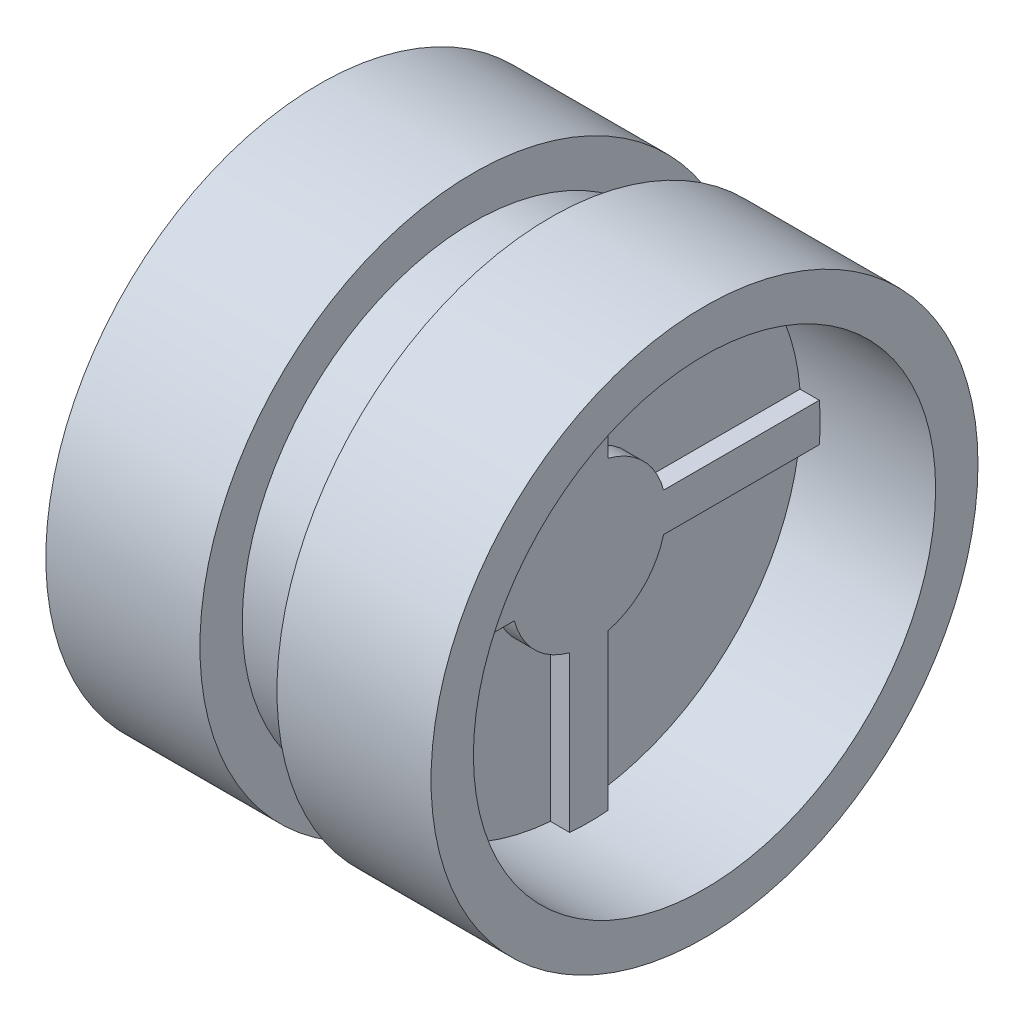
ISO-10303-21;
HEADER;
FILE_DESCRIPTION(('STEP AP214'),'2;1');
FILE_NAME('part.step','',(''),(''),'','','');
FILE_SCHEMA(('AUTOMOTIVE_DESIGN { 1 0 10303 214 1 1 1 1 }'));
ENDSEC;
DATA;
#1=APPLICATION_CONTEXT('core data for automotive mechanical design processes');
#2=APPLICATION_PROTOCOL_DEFINITION('international standard','automotive_design',2000,#1);
#3=PRODUCT_CONTEXT('',#1,'mechanical');
#4=PRODUCT('Part','Part','',(#3));
#5=PRODUCT_RELATED_PRODUCT_CATEGORY('part','',(#4));
#6=PRODUCT_DEFINITION_FORMATION('','',#4);
#7=PRODUCT_DEFINITION_CONTEXT('part definition',#1,'design');
#8=PRODUCT_DEFINITION('design','',#6,#7);
#9=PRODUCT_DEFINITION_SHAPE('','',#8);
#10=(LENGTH_UNIT() NAMED_UNIT(*) SI_UNIT(.MILLI.,.METRE.));
#11=(NAMED_UNIT(*) PLANE_ANGLE_UNIT() SI_UNIT($,.RADIAN.));
#12=(NAMED_UNIT(*) SI_UNIT($,.STERADIAN.) SOLID_ANGLE_UNIT());
#13=UNCERTAINTY_MEASURE_WITH_UNIT(LENGTH_MEASURE(1.E-05),#10,'distance_accuracy_value','');
#14=(GEOMETRIC_REPRESENTATION_CONTEXT(3) GLOBAL_UNCERTAINTY_ASSIGNED_CONTEXT((#13)) GLOBAL_UNIT_ASSIGNED_CONTEXT((#10,
#11,#12)) REPRESENTATION_CONTEXT('',''));
#15=CARTESIAN_POINT('',(0.,0.,0.));
#16=DIRECTION('',(0.,0.,1.));
#17=DIRECTION('',(1.,0.,0.));
#18=AXIS2_PLACEMENT_3D('',#15,#16,#17);
#19=CARTESIAN_POINT('',(1.5,6.,0.));
#20=DIRECTION('',(1.,0.,0.));
#21=DIRECTION('',(0.,0.,-1.));
#22=AXIS2_PLACEMENT_3D('',#19,#20,#21);
#23=PLANE('',#22);
#24=DIRECTION('',(0.,1.,0.));
#25=VECTOR('',#24,1.);
#26=CARTESIAN_POINT('',(1.5,6.,-0.500000000000192));
#27=LINE('',#26,#25);
#28=CARTESIAN_POINT('',(1.5,-5.97913037155068,-0.500000000000192));
#29=VERTEX_POINT('',#28);
#30=CARTESIAN_POINT('',(1.5,-1.93649167310366,-0.500000000000192));
#31=VERTEX_POINT('',#30);
#32=EDGE_CURVE('E151',#29,#31,#27,.T.);
#33=ORIENTED_EDGE('',*,*,#32,.F.);
#34=CARTESIAN_POINT('',(1.5,0.,0.));
#35=DIRECTION('',(1.,0.,0.));
#36=DIRECTION('',(0.,0.,-1.));
#37=AXIS2_PLACEMENT_3D('',#34,#35,#36);
#38=CIRCLE('',#37,6.);
#39=CARTESIAN_POINT('',(1.5,-0.499999999999919,-5.97913037155071));
#40=VERTEX_POINT('',#39);
#41=EDGE_CURVE('E259',#29,#40,#38,.T.);
#42=ORIENTED_EDGE('',*,*,#41,.T.);
#43=DIRECTION('',(0.,0.,1.));
#44=VECTOR('',#43,1.);
#45=CARTESIAN_POINT('',(1.5,-0.500000000000039,-1.30743457061774E-13));
#46=LINE('',#45,#44);
#47=CARTESIAN_POINT('',(1.5,-0.5,-1.93649167310371));
#48=VERTEX_POINT('',#47);
#49=EDGE_CURVE('E53',#40,#48,#46,.T.);
#50=ORIENTED_EDGE('',*,*,#49,.T.);
#51=CARTESIAN_POINT('',(1.5,0.,0.));
#52=DIRECTION('',(1.,0.,0.));
#53=DIRECTION('',(0.,0.,-1.));
#54=AXIS2_PLACEMENT_3D('',#51,#52,#53);
#55=CIRCLE('',#54,2.);
#56=EDGE_CURVE('E11',#48,#31,#55,.F.);
#57=ORIENTED_EDGE('',*,*,#56,.T.);
#58=EDGE_LOOP('',(#33,#42,#50,#57));
#59=FACE_BOUND('',#58,.T.);
#60=ADVANCED_FACE('F35',(#59),#23,.T.);
#61=DIRECTION('',(0.,0.,1.));
#62=VECTOR('',#61,1.);
#63=CARTESIAN_POINT('',(1.5,0.500000000000192,0.));
#64=LINE('',#63,#62);
#65=CARTESIAN_POINT('',(1.5,0.500000000000191,-5.97913037155068));
#66=VERTEX_POINT('',#65);
#67=CARTESIAN_POINT('',(1.5,0.500000000000192,-1.93649167310366));
#68=VERTEX_POINT('',#67);
#69=EDGE_CURVE('E252',#66,#68,#64,.T.);
#70=ORIENTED_EDGE('',*,*,#69,.F.);
#71=CARTESIAN_POINT('',(1.5,5.9791303715507,-0.5));
#72=VERTEX_POINT('',#71);
#73=EDGE_CURVE('E260',#66,#72,#38,.T.);
#74=ORIENTED_EDGE('',*,*,#73,.T.);
#75=DIRECTION('',(0.,-1.,0.));
#76=VECTOR('',#75,1.);
#77=CARTESIAN_POINT('',(1.5,6.,-0.5));
#78=LINE('',#77,#76);
#79=CARTESIAN_POINT('',(1.5,1.93649167310371,-0.5));
#80=VERTEX_POINT('',#79);
#81=EDGE_CURVE('E250',#72,#80,#78,.T.);
#82=ORIENTED_EDGE('',*,*,#81,.T.);
#83=CARTESIAN_POINT('',(1.5,0.,0.));
#84=DIRECTION('',(1.,0.,0.));
#85=DIRECTION('',(0.,0.,-1.));
#86=AXIS2_PLACEMENT_3D('',#83,#84,#85);
#87=CIRCLE('',#86,2.);
#88=EDGE_CURVE('E43',#80,#68,#87,.F.);
#89=ORIENTED_EDGE('',*,*,#88,.T.);
#90=EDGE_LOOP('',(#70,#74,#82,#89));
#91=FACE_BOUND('',#90,.T.);
#92=ADVANCED_FACE('F302',(#91),#23,.T.);
#93=DIRECTION('',(0.,-1.,0.));
#94=VECTOR('',#93,1.);
#95=CARTESIAN_POINT('',(1.5,6.00000000000001,0.500000000000105));
#96=LINE('',#95,#94);
#97=CARTESIAN_POINT('',(1.5,5.97913037155069,0.500000000000105));
#98=VERTEX_POINT('',#97);
#99=CARTESIAN_POINT('',(1.5,1.93649167310366,0.500000000000192));
#100=VERTEX_POINT('',#99);
#101=EDGE_CURVE('E247',#98,#100,#96,.T.);
#102=ORIENTED_EDGE('',*,*,#101,.F.);
#103=CARTESIAN_POINT('',(1.5,0.500000000000003,5.9791303715507));
#104=VERTEX_POINT('',#103);
#105=EDGE_CURVE('E264',#98,#104,#38,.T.);
#106=ORIENTED_EDGE('',*,*,#105,.T.);
#107=DIRECTION('',(0.,0.,-1.));
#108=VECTOR('',#107,1.);
#109=CARTESIAN_POINT('',(1.5,0.499999999999998,0.));
#110=LINE('',#109,#108);
#111=CARTESIAN_POINT('',(1.5,0.499999999999999,1.93649167310371));
#112=VERTEX_POINT('',#111);
#113=EDGE_CURVE('E245',#104,#112,#110,.T.);
#114=ORIENTED_EDGE('',*,*,#113,.T.);
#115=CARTESIAN_POINT('',(1.5,0.,0.));
#116=DIRECTION('',(1.,0.,0.));
#117=DIRECTION('',(0.,0.,-1.));
#118=AXIS2_PLACEMENT_3D('',#115,#116,#117);
#119=CIRCLE('',#118,2.);
#120=EDGE_CURVE('E299',#112,#100,#119,.F.);
#121=ORIENTED_EDGE('',*,*,#120,.T.);
#122=EDGE_LOOP('',(#102,#106,#114,#121));
#123=FACE_BOUND('',#122,.T.);
#124=ADVANCED_FACE('F337',(#123),#23,.T.);
#125=CARTESIAN_POINT('',(1.5,0.,0.));
#126=DIRECTION('',(1.,0.,0.));
#127=DIRECTION('',(0.,0.,-1.));
#128=AXIS2_PLACEMENT_3D('',#125,#126,#127);
#129=CYLINDRICAL_SURFACE('',#128,6.);
#130=CARTESIAN_POINT('',(5.,0.,0.));
#131=DIRECTION('',(1.,0.,0.));
#132=DIRECTION('',(0.,0.,-1.));
#133=AXIS2_PLACEMENT_3D('',#130,#131,#132);
#134=CIRCLE('',#133,6.);
#135=CARTESIAN_POINT('',(5.,0.,-6.));
#136=VERTEX_POINT('',#135);
#137=EDGE_CURVE('E263',#136,#136,#134,.T.);
#138=ORIENTED_EDGE('',*,*,#137,.T.);
#139=EDGE_LOOP('',(#138));
#140=FACE_BOUND('',#139,.T.);
#141=CARTESIAN_POINT('',(2.,0.,0.));
#142=DIRECTION('',(1.,0.,0.));
#143=DIRECTION('',(0.,0.,-1.));
#144=AXIS2_PLACEMENT_3D('',#141,#142,#143);
#145=CIRCLE('',#144,6.00000000000005);
#146=CARTESIAN_POINT('',(2.,5.9791303715507,-0.5));
#147=VERTEX_POINT('',#146);
#148=CARTESIAN_POINT('',(2.,5.97913037155069,0.500000000000096));
#149=VERTEX_POINT('',#148);
#150=EDGE_CURVE('E186',#147,#149,#145,.T.);
#151=ORIENTED_EDGE('',*,*,#150,.F.);
#152=DIRECTION('',(-1.,0.,0.));
#153=VECTOR('',#152,1.);
#154=CARTESIAN_POINT('',(2.,5.9791303715507,-0.5));
#155=LINE('',#154,#153);
#156=EDGE_CURVE('E225',#147,#72,#155,.T.);
#157=ORIENTED_EDGE('',*,*,#156,.T.);
#158=ORIENTED_EDGE('',*,*,#73,.F.);
#159=DIRECTION('',(-1.,0.,0.));
#160=VECTOR('',#159,1.);
#161=CARTESIAN_POINT('',(2.,0.500000000000191,-5.97913037155074));
#162=LINE('',#161,#160);
#163=CARTESIAN_POINT('',(2.,0.500000000000191,-5.97913037155074));
#164=VERTEX_POINT('',#163);
#165=EDGE_CURVE('E233',#164,#66,#162,.T.);
#166=ORIENTED_EDGE('',*,*,#165,.F.);
#167=CARTESIAN_POINT('',(2.,0.,0.));
#168=DIRECTION('',(1.,0.,0.));
#169=DIRECTION('',(0.,0.,-1.));
#170=AXIS2_PLACEMENT_3D('',#167,#168,#169);
#171=CIRCLE('',#170,6.0000000000001);
#172=CARTESIAN_POINT('',(2.,-0.499999999999919,-5.9791303715507));
#173=VERTEX_POINT('',#172);
#174=EDGE_CURVE('E175',#173,#164,#171,.T.);
#175=ORIENTED_EDGE('',*,*,#174,.F.);
#176=DIRECTION('',(-1.,0.,0.));
#177=VECTOR('',#176,1.);
#178=CARTESIAN_POINT('',(2.,-0.499999999999919,-5.97913037155084));
#179=LINE('',#178,#177);
#180=EDGE_CURVE('E236',#173,#40,#179,.T.);
#181=ORIENTED_EDGE('',*,*,#180,.T.);
#182=ORIENTED_EDGE('',*,*,#41,.F.);
#183=DIRECTION('',(-1.,0.,0.));
#184=VECTOR('',#183,1.);
#185=CARTESIAN_POINT('',(2.,-5.97913037155078,-0.500000000000192));
#186=LINE('',#185,#184);
#187=CARTESIAN_POINT('',(2.,-5.97913037155068,-0.500000000000184));
#188=VERTEX_POINT('',#187);
#189=EDGE_CURVE('E153',#188,#29,#186,.T.);
#190=ORIENTED_EDGE('',*,*,#189,.F.);
#191=CARTESIAN_POINT('',(2.,0.,0.));
#192=DIRECTION('',(1.,0.,0.));
#193=DIRECTION('',(0.,0.,-1.));
#194=AXIS2_PLACEMENT_3D('',#191,#192,#193);
#195=CIRCLE('',#194,6.00000000000007);
#196=CARTESIAN_POINT('',(2.,-5.9791303715507,0.500000000000003));
#197=VERTEX_POINT('',#196);
#198=EDGE_CURVE('E168',#197,#188,#195,.T.);
#199=ORIENTED_EDGE('',*,*,#198,.F.);
#200=DIRECTION('',(-1.,0.,0.));
#201=VECTOR('',#200,1.);
#202=CARTESIAN_POINT('',(2.,-5.97913037155075,0.500000000000003));
#203=LINE('',#202,#201);
#204=CARTESIAN_POINT('',(1.5,-5.9791303715507,0.500000000000003));
#205=VERTEX_POINT('',#204);
#206=EDGE_CURVE('E240',#197,#205,#203,.T.);
#207=ORIENTED_EDGE('',*,*,#206,.T.);
#208=CARTESIAN_POINT('',(1.5,-0.500000000000192,5.97913037155068));
#209=VERTEX_POINT('',#208);
#210=EDGE_CURVE('E338',#209,#205,#38,.T.);
#211=ORIENTED_EDGE('',*,*,#210,.F.);
#212=DIRECTION('',(-1.,0.,0.));
#213=VECTOR('',#212,1.);
#214=CARTESIAN_POINT('',(2.,-0.500000000000192,5.97913037155074));
#215=LINE('',#214,#213);
#216=CARTESIAN_POINT('',(2.,-0.500000000000187,5.97913037155068));
#217=VERTEX_POINT('',#216);
#218=EDGE_CURVE('E211',#217,#209,#215,.T.);
#219=ORIENTED_EDGE('',*,*,#218,.F.);
#220=CARTESIAN_POINT('',(2.,0.,0.));
#221=DIRECTION('',(1.,0.,0.));
#222=DIRECTION('',(0.,0.,-1.));
#223=AXIS2_PLACEMENT_3D('',#220,#221,#222);
#224=CIRCLE('',#223,6.00000000000005);
#225=CARTESIAN_POINT('',(2.,0.500000000000003,5.9791303715507));
#226=VERTEX_POINT('',#225);
#227=EDGE_CURVE('E197',#226,#217,#224,.T.);
#228=ORIENTED_EDGE('',*,*,#227,.F.);
#229=DIRECTION('',(-1.,0.,0.));
#230=VECTOR('',#229,1.);
#231=CARTESIAN_POINT('',(2.,0.500000000000003,5.97913037155075));
#232=LINE('',#231,#230);
#233=EDGE_CURVE('E214',#226,#104,#232,.T.);
#234=ORIENTED_EDGE('',*,*,#233,.T.);
#235=ORIENTED_EDGE('',*,*,#105,.F.);
#236=DIRECTION('',(-1.,0.,0.));
#237=VECTOR('',#236,1.);
#238=CARTESIAN_POINT('',(2.,5.9791303715508,0.500000000000105));
#239=LINE('',#238,#237);
#240=EDGE_CURVE('E222',#149,#98,#239,.T.);
#241=ORIENTED_EDGE('',*,*,#240,.F.);
#242=EDGE_LOOP('',(#151,#157,#158,#166,#175,#181,#182,#190,#199,#207,#211,#219,#228,#234,#235,#241));
#243=FACE_BOUND('',#242,.T.);
#244=ADVANCED_FACE('F315',(#140,#243),#129,.F.);
#245=ORIENTED_EDGE('',*,*,#210,.T.);
#246=DIRECTION('',(0.,1.,0.));
#247=VECTOR('',#246,1.);
#248=CARTESIAN_POINT('',(1.5,6.,0.499999999999993));
#249=LINE('',#248,#247);
#250=CARTESIAN_POINT('',(1.5,-1.93649167310369,0.499999999999994));
#251=VERTEX_POINT('',#250);
#252=EDGE_CURVE('E257',#205,#251,#249,.T.);
#253=ORIENTED_EDGE('',*,*,#252,.T.);
#254=CARTESIAN_POINT('',(1.5,0.,0.));
#255=DIRECTION('',(1.,0.,0.));
#256=DIRECTION('',(0.,0.,-1.));
#257=AXIS2_PLACEMENT_3D('',#254,#255,#256);
#258=CIRCLE('',#257,1.99999999999998);
#259=CARTESIAN_POINT('',(1.5,-0.500000000000144,1.93649167310365));
#260=VERTEX_POINT('',#259);
#261=EDGE_CURVE('E297',#251,#260,#258,.F.);
#262=ORIENTED_EDGE('',*,*,#261,.T.);
#263=DIRECTION('',(0.,0.,-1.));
#264=VECTOR('',#263,1.);
#265=CARTESIAN_POINT('',(1.5,-0.500000000000112,0.));
#266=LINE('',#265,#264);
#267=EDGE_CURVE('E242',#209,#260,#266,.T.);
#268=ORIENTED_EDGE('',*,*,#267,.F.);
#269=EDGE_LOOP('',(#245,#253,#262,#268));
#270=FACE_BOUND('',#269,.T.);
#271=ADVANCED_FACE('F37',(#270),#23,.T.);
#272=CARTESIAN_POINT('',(-5.,0.,0.));
#273=DIRECTION('',(-1.,0.,0.));
#274=DIRECTION('',(0.,0.,1.));
#275=AXIS2_PLACEMENT_3D('',#272,#273,#274);
#276=PLANE('',#275);
#277=CARTESIAN_POINT('',(-5.,0.,0.));
#278=DIRECTION('',(-1.,0.,0.));
#279=DIRECTION('',(0.,0.,1.));
#280=AXIS2_PLACEMENT_3D('',#277,#278,#279);
#281=CIRCLE('',#280,1.5);
#282=CARTESIAN_POINT('',(-5.,0.,1.5));
#283=VERTEX_POINT('',#282);
#284=EDGE_CURVE('E549',#283,#283,#281,.T.);
#285=ORIENTED_EDGE('',*,*,#284,.F.);
#286=EDGE_LOOP('',(#285));
#287=FACE_BOUND('',#286,.T.);
#288=CARTESIAN_POINT('',(-5.,0.,0.));
#289=DIRECTION('',(1.,0.,0.));
#290=DIRECTION('',(0.,0.,-1.));
#291=AXIS2_PLACEMENT_3D('',#288,#289,#290);
#292=CIRCLE('',#291,3.);
#293=CARTESIAN_POINT('',(-5.,0.,-3.));
#294=VERTEX_POINT('',#293);
#295=EDGE_CURVE('E294',#294,#294,#292,.T.);
#296=ORIENTED_EDGE('',*,*,#295,.F.);
#297=EDGE_LOOP('',(#296));
#298=FACE_BOUND('',#297,.T.);
#299=ADVANCED_FACE('F358',(#287,#298),#276,.T.);
#300=CARTESIAN_POINT('',(1.5,0.,0.));
#301=DIRECTION('',(1.,0.,0.));
#302=DIRECTION('',(0.,0.,-1.));
#303=AXIS2_PLACEMENT_3D('',#300,#301,#302);
#304=CYLINDRICAL_SURFACE('',#303,3.);
#305=ORIENTED_EDGE('',*,*,#295,.T.);
#306=EDGE_LOOP('',(#305));
#307=FACE_BOUND('',#306,.T.);
#308=CARTESIAN_POINT('',(-1.5,0.,0.));
#309=DIRECTION('',(1.,0.,0.));
#310=DIRECTION('',(0.,0.,-1.));
#311=AXIS2_PLACEMENT_3D('',#308,#309,#310);
#312=CIRCLE('',#311,3.);
#313=CARTESIAN_POINT('',(-1.5,0.,-3.));
#314=VERTEX_POINT('',#313);
#315=EDGE_CURVE('E291',#314,#314,#312,.T.);
#316=ORIENTED_EDGE('',*,*,#315,.F.);
#317=EDGE_LOOP('',(#316));
#318=FACE_BOUND('',#317,.T.);
#319=ADVANCED_FACE('F363',(#307,#318),#304,.T.);
#320=CARTESIAN_POINT('',(-1.5,3.,0.));
#321=DIRECTION('',(-1.,0.,0.));
#322=DIRECTION('',(0.,0.,1.));
#323=AXIS2_PLACEMENT_3D('',#320,#321,#322);
#324=PLANE('',#323);
#325=ORIENTED_EDGE('',*,*,#315,.T.);
#326=EDGE_LOOP('',(#325));
#327=FACE_BOUND('',#326,.T.);
#328=CARTESIAN_POINT('',(-1.5,0.,0.));
#329=DIRECTION('',(1.,0.,0.));
#330=DIRECTION('',(0.,0.,-1.));
#331=AXIS2_PLACEMENT_3D('',#328,#329,#330);
#332=CIRCLE('',#331,6.);
#333=CARTESIAN_POINT('',(-1.5,0.,-6.));
#334=VERTEX_POINT('',#333);
#335=EDGE_CURVE('E288',#334,#334,#332,.T.);
#336=ORIENTED_EDGE('',*,*,#335,.F.);
#337=EDGE_LOOP('',(#336));
#338=FACE_BOUND('',#337,.T.);
#339=ADVANCED_FACE('F559',(#327,#338),#324,.T.);
#340=CARTESIAN_POINT('',(1.5,0.,0.));
#341=DIRECTION('',(1.,0.,0.));
#342=DIRECTION('',(0.,0.,-1.));
#343=AXIS2_PLACEMENT_3D('',#340,#341,#342);
#344=CYLINDRICAL_SURFACE('',#343,6.);
#345=ORIENTED_EDGE('',*,*,#335,.T.);
#346=EDGE_LOOP('',(#345));
#347=FACE_BOUND('',#346,.T.);
#348=CARTESIAN_POINT('',(-5.,0.,0.));
#349=DIRECTION('',(1.,0.,0.));
#350=DIRECTION('',(0.,0.,-1.));
#351=AXIS2_PLACEMENT_3D('',#348,#349,#350);
#352=CIRCLE('',#351,6.);
#353=CARTESIAN_POINT('',(-5.,0.,-6.));
#354=VERTEX_POINT('',#353);
#355=EDGE_CURVE('E285',#354,#354,#352,.T.);
#356=ORIENTED_EDGE('',*,*,#355,.F.);
#357=EDGE_LOOP('',(#356));
#358=FACE_BOUND('',#357,.T.);
#359=ADVANCED_FACE('F565',(#347,#358),#344,.F.);
#360=CARTESIAN_POINT('',(-5.,6.,0.));
#361=DIRECTION('',(-1.,0.,0.));
#362=DIRECTION('',(0.,0.,1.));
#363=AXIS2_PLACEMENT_3D('',#360,#361,#362);
#364=PLANE('',#363);
#365=ORIENTED_EDGE('',*,*,#355,.T.);
#366=EDGE_LOOP('',(#365));
#367=FACE_BOUND('',#366,.T.);
#368=CARTESIAN_POINT('',(-5.,0.,0.));
#369=DIRECTION('',(1.,0.,0.));
#370=DIRECTION('',(0.,0.,-1.));
#371=AXIS2_PLACEMENT_3D('',#368,#369,#370);
#372=CIRCLE('',#371,7.1);
#373=CARTESIAN_POINT('',(-5.,0.,-7.1));
#374=VERTEX_POINT('',#373);
#375=EDGE_CURVE('E282',#374,#374,#372,.T.);
#376=ORIENTED_EDGE('',*,*,#375,.F.);
#377=EDGE_LOOP('',(#376));
#378=FACE_BOUND('',#377,.T.);
#379=ADVANCED_FACE('F571',(#367,#378),#364,.T.);
#380=CARTESIAN_POINT('',(1.5,0.,0.));
#381=DIRECTION('',(1.,0.,0.));
#382=DIRECTION('',(0.,0.,-1.));
#383=AXIS2_PLACEMENT_3D('',#380,#381,#382);
#384=CYLINDRICAL_SURFACE('',#383,7.1);
#385=ORIENTED_EDGE('',*,*,#375,.T.);
#386=EDGE_LOOP('',(#385));
#387=FACE_BOUND('',#386,.T.);
#388=CARTESIAN_POINT('',(-1.,0.,0.));
#389=DIRECTION('',(1.,0.,0.));
#390=DIRECTION('',(0.,0.,-1.));
#391=AXIS2_PLACEMENT_3D('',#388,#389,#390);
#392=CIRCLE('',#391,7.1);
#393=CARTESIAN_POINT('',(-1.,0.,-7.1));
#394=VERTEX_POINT('',#393);
#395=EDGE_CURVE('E279',#394,#394,#392,.T.);
#396=ORIENTED_EDGE('',*,*,#395,.F.);
#397=EDGE_LOOP('',(#396));
#398=FACE_BOUND('',#397,.T.);
#399=ADVANCED_FACE('F577',(#387,#398),#384,.T.);
#400=CARTESIAN_POINT('',(-1.,7.1,0.));
#401=DIRECTION('',(1.,0.,0.));
#402=DIRECTION('',(0.,0.,-1.));
#403=AXIS2_PLACEMENT_3D('',#400,#401,#402);
#404=PLANE('',#403);
#405=ORIENTED_EDGE('',*,*,#395,.T.);
#406=EDGE_LOOP('',(#405));
#407=FACE_BOUND('',#406,.T.);
#408=CARTESIAN_POINT('',(-1.,0.,0.));
#409=DIRECTION('',(1.,0.,0.));
#410=DIRECTION('',(0.,0.,-1.));
#411=AXIS2_PLACEMENT_3D('',#408,#409,#410);
#412=CIRCLE('',#411,6.);
#413=CARTESIAN_POINT('',(-1.,0.,-6.));
#414=VERTEX_POINT('',#413);
#415=EDGE_CURVE('E276',#414,#414,#412,.T.);
#416=ORIENTED_EDGE('',*,*,#415,.F.);
#417=EDGE_LOOP('',(#416));
#418=FACE_BOUND('',#417,.T.);
#419=ADVANCED_FACE('F393',(#407,#418),#404,.T.);
#420=CARTESIAN_POINT('',(1.5,0.,0.));
#421=DIRECTION('',(1.,0.,0.));
#422=DIRECTION('',(0.,0.,-1.));
#423=AXIS2_PLACEMENT_3D('',#420,#421,#422);
#424=CYLINDRICAL_SURFACE('',#423,6.);
#425=CARTESIAN_POINT('',(1.,0.,0.));
#426=DIRECTION('',(1.,0.,0.));
#427=DIRECTION('',(0.,0.,-1.));
#428=AXIS2_PLACEMENT_3D('',#425,#426,#427);
#429=CIRCLE('',#428,6.);
#430=CARTESIAN_POINT('',(1.,0.,-6.));
#431=VERTEX_POINT('',#430);
#432=EDGE_CURVE('E273',#431,#431,#429,.T.);
#433=ORIENTED_EDGE('',*,*,#432,.F.);
#434=EDGE_LOOP('',(#433));
#435=FACE_BOUND('',#434,.T.);
#436=ORIENTED_EDGE('',*,*,#415,.T.);
#437=EDGE_LOOP('',(#436));
#438=FACE_BOUND('',#437,.T.);
#439=ADVANCED_FACE('F387',(#435,#438),#424,.T.);
#440=CARTESIAN_POINT('',(1.,7.1,0.));
#441=DIRECTION('',(-1.,0.,0.));
#442=DIRECTION('',(0.,0.,1.));
#443=AXIS2_PLACEMENT_3D('',#440,#441,#442);
#444=PLANE('',#443);
#445=ORIENTED_EDGE('',*,*,#432,.T.);
#446=EDGE_LOOP('',(#445));
#447=FACE_BOUND('',#446,.T.);
#448=CARTESIAN_POINT('',(1.,0.,0.));
#449=DIRECTION('',(1.,0.,0.));
#450=DIRECTION('',(0.,0.,-1.));
#451=AXIS2_PLACEMENT_3D('',#448,#449,#450);
#452=CIRCLE('',#451,7.1);
#453=CARTESIAN_POINT('',(1.,0.,-7.1));
#454=VERTEX_POINT('',#453);
#455=EDGE_CURVE('E270',#454,#454,#452,.T.);
#456=ORIENTED_EDGE('',*,*,#455,.F.);
#457=EDGE_LOOP('',(#456));
#458=FACE_BOUND('',#457,.T.);
#459=ADVANCED_FACE('F392',(#447,#458),#444,.T.);
#460=CARTESIAN_POINT('',(1.5,0.,0.));
#461=DIRECTION('',(1.,0.,0.));
#462=DIRECTION('',(0.,0.,-1.));
#463=AXIS2_PLACEMENT_3D('',#460,#461,#462);
#464=CYLINDRICAL_SURFACE('',#463,7.1);
#465=ORIENTED_EDGE('',*,*,#455,.T.);
#466=EDGE_LOOP('',(#465));
#467=FACE_BOUND('',#466,.T.);
#468=CARTESIAN_POINT('',(5.,0.,0.));
#469=DIRECTION('',(1.,0.,0.));
#470=DIRECTION('',(0.,0.,-1.));
#471=AXIS2_PLACEMENT_3D('',#468,#469,#470);
#472=CIRCLE('',#471,7.1);
#473=CARTESIAN_POINT('',(5.,0.,-7.1));
#474=VERTEX_POINT('',#473);
#475=EDGE_CURVE('E267',#474,#474,#472,.T.);
#476=ORIENTED_EDGE('',*,*,#475,.F.);
#477=EDGE_LOOP('',(#476));
#478=FACE_BOUND('',#477,.T.);
#479=ADVANCED_FACE('F405',(#467,#478),#464,.T.);
#480=CARTESIAN_POINT('',(5.,6.,0.));
#481=DIRECTION('',(1.,0.,0.));
#482=DIRECTION('',(0.,0.,-1.));
#483=AXIS2_PLACEMENT_3D('',#480,#481,#482);
#484=PLANE('',#483);
#485=ORIENTED_EDGE('',*,*,#475,.T.);
#486=EDGE_LOOP('',(#485));
#487=FACE_BOUND('',#486,.T.);
#488=ORIENTED_EDGE('',*,*,#137,.F.);
#489=EDGE_LOOP('',(#488));
#490=FACE_BOUND('',#489,.T.);
#491=ADVANCED_FACE('F418',(#487,#490),#484,.T.);
#492=CARTESIAN_POINT('',(2.,0.,0.499999999999998));
#493=DIRECTION('',(0.,0.,-1.));
#494=DIRECTION('',(0.,1.,0.));
#495=AXIS2_PLACEMENT_3D('',#492,#493,#494);
#496=PLANE('',#495);
#497=ORIENTED_EDGE('',*,*,#252,.F.);
#498=ORIENTED_EDGE('',*,*,#206,.F.);
#499=DIRECTION('',(0.,-1.,0.));
#500=VECTOR('',#499,1.);
#501=CARTESIAN_POINT('',(2.,0.,0.499999999999998));
#502=LINE('',#501,#500);
#503=CARTESIAN_POINT('',(2.,-1.93649167310371,0.5));
#504=VERTEX_POINT('',#503);
#505=EDGE_CURVE('E170',#504,#197,#502,.T.);
#506=ORIENTED_EDGE('',*,*,#505,.F.);
#507=DIRECTION('',(-1.,0.,0.));
#508=VECTOR('',#507,1.);
#509=CARTESIAN_POINT('',(2.,-1.93649167310371,0.5));
#510=LINE('',#509,#508);
#511=EDGE_CURVE('E205',#504,#251,#510,.T.);
#512=ORIENTED_EDGE('',*,*,#511,.T.);
#513=EDGE_LOOP('',(#497,#498,#506,#512));
#514=FACE_BOUND('',#513,.T.);
#515=ADVANCED_FACE('F413',(#514),#496,.F.);
#516=CARTESIAN_POINT('',(2.,0.,-0.500000000000192));
#517=DIRECTION('',(0.,0.,-1.));
#518=DIRECTION('',(0.,1.,0.));
#519=AXIS2_PLACEMENT_3D('',#516,#517,#518);
#520=PLANE('',#519);
#521=ORIENTED_EDGE('',*,*,#189,.T.);
#522=ORIENTED_EDGE('',*,*,#32,.T.);
#523=DIRECTION('',(-1.,0.,0.));
#524=VECTOR('',#523,1.);
#525=CARTESIAN_POINT('',(2.,-1.93649167310366,-0.500000000000192));
#526=LINE('',#525,#524);
#527=CARTESIAN_POINT('',(2.,-1.93649167310366,-0.500000000000192));
#528=VERTEX_POINT('',#527);
#529=EDGE_CURVE('E145',#528,#31,#526,.T.);
#530=ORIENTED_EDGE('',*,*,#529,.F.);
#531=DIRECTION('',(0.,-1.,0.));
#532=VECTOR('',#531,1.);
#533=CARTESIAN_POINT('',(2.,0.,-0.500000000000192));
#534=LINE('',#533,#532);
#535=EDGE_CURVE('E150',#528,#188,#534,.T.);
#536=ORIENTED_EDGE('',*,*,#535,.T.);
#537=EDGE_LOOP('',(#521,#522,#530,#536));
#538=FACE_BOUND('',#537,.T.);
#539=ADVANCED_FACE('F148',(#538),#520,.T.);
#540=CARTESIAN_POINT('',(2.,0.,0.));
#541=DIRECTION('',(-1.,0.,0.));
#542=DIRECTION('',(0.,0.,1.));
#543=AXIS2_PLACEMENT_3D('',#540,#541,#542);
#544=CYLINDRICAL_SURFACE('',#543,2.);
#545=ORIENTED_EDGE('',*,*,#56,.F.);
#546=DIRECTION('',(-1.,0.,0.));
#547=VECTOR('',#546,1.);
#548=CARTESIAN_POINT('',(2.,-0.5,-1.93649167310371));
#549=LINE('',#548,#547);
#550=CARTESIAN_POINT('',(2.,-0.5,-1.93649167310371));
#551=VERTEX_POINT('',#550);
#552=EDGE_CURVE('E154',#551,#48,#549,.T.);
#553=ORIENTED_EDGE('',*,*,#552,.F.);
#554=CARTESIAN_POINT('',(2.,0.,0.));
#555=DIRECTION('',(1.,0.,0.));
#556=DIRECTION('',(0.,0.,-1.));
#557=AXIS2_PLACEMENT_3D('',#554,#555,#556);
#558=CIRCLE('',#557,2.);
#559=EDGE_CURVE('E157',#528,#551,#558,.T.);
#560=ORIENTED_EDGE('',*,*,#559,.F.);
#561=ORIENTED_EDGE('',*,*,#529,.T.);
#562=EDGE_LOOP('',(#545,#553,#560,#561));
#563=FACE_BOUND('',#562,.T.);
#564=ADVANCED_FACE('F158',(#563),#544,.T.);
#565=CARTESIAN_POINT('',(2.,-0.500000000000039,0.));
#566=DIRECTION('',(0.,1.,0.));
#567=DIRECTION('',(0.,0.,1.));
#568=AXIS2_PLACEMENT_3D('',#565,#566,#567);
#569=PLANE('',#568);
#570=ORIENTED_EDGE('',*,*,#49,.F.);
#571=ORIENTED_EDGE('',*,*,#180,.F.);
#572=DIRECTION('',(0.,0.,-1.));
#573=VECTOR('',#572,1.);
#574=CARTESIAN_POINT('',(2.,-0.500000000000039,0.));
#575=LINE('',#574,#573);
#576=EDGE_CURVE('E163',#551,#173,#575,.T.);
#577=ORIENTED_EDGE('',*,*,#576,.F.);
#578=ORIENTED_EDGE('',*,*,#552,.T.);
#579=EDGE_LOOP('',(#570,#571,#577,#578));
#580=FACE_BOUND('',#579,.T.);
#581=ADVANCED_FACE('F344',(#580),#569,.F.);
#582=CARTESIAN_POINT('',(2.,0.500000000000192,0.));
#583=DIRECTION('',(0.,1.,0.));
#584=DIRECTION('',(0.,0.,1.));
#585=AXIS2_PLACEMENT_3D('',#582,#583,#584);
#586=PLANE('',#585);
#587=ORIENTED_EDGE('',*,*,#165,.T.);
#588=ORIENTED_EDGE('',*,*,#69,.T.);
#589=DIRECTION('',(-1.,0.,0.));
#590=VECTOR('',#589,1.);
#591=CARTESIAN_POINT('',(2.,0.500000000000192,-1.93649167310366));
#592=LINE('',#591,#590);
#593=CARTESIAN_POINT('',(2.,0.500000000000192,-1.93649167310366));
#594=VERTEX_POINT('',#593);
#595=EDGE_CURVE('E230',#594,#68,#592,.T.);
#596=ORIENTED_EDGE('',*,*,#595,.F.);
#597=DIRECTION('',(0.,0.,-1.));
#598=VECTOR('',#597,1.);
#599=CARTESIAN_POINT('',(2.,0.500000000000192,0.));
#600=LINE('',#599,#598);
#601=EDGE_CURVE('E178',#594,#164,#600,.T.);
#602=ORIENTED_EDGE('',*,*,#601,.T.);
#603=EDGE_LOOP('',(#587,#588,#596,#602));
#604=FACE_BOUND('',#603,.T.);
#605=ADVANCED_FACE('F308',(#604),#586,.T.);
#606=CARTESIAN_POINT('',(2.,0.,0.));
#607=DIRECTION('',(-1.,0.,0.));
#608=DIRECTION('',(0.,0.,1.));
#609=AXIS2_PLACEMENT_3D('',#606,#607,#608);
#610=CYLINDRICAL_SURFACE('',#609,2.);
#611=ORIENTED_EDGE('',*,*,#88,.F.);
#612=DIRECTION('',(-1.,0.,0.));
#613=VECTOR('',#612,1.);
#614=CARTESIAN_POINT('',(2.,1.93649167310371,-0.5));
#615=LINE('',#614,#613);
#616=CARTESIAN_POINT('',(2.,1.93649167310371,-0.5));
#617=VERTEX_POINT('',#616);
#618=EDGE_CURVE('E227',#617,#80,#615,.T.);
#619=ORIENTED_EDGE('',*,*,#618,.F.);
#620=CARTESIAN_POINT('',(2.,0.,0.));
#621=DIRECTION('',(1.,0.,0.));
#622=DIRECTION('',(0.,0.,-1.));
#623=AXIS2_PLACEMENT_3D('',#620,#621,#622);
#624=CIRCLE('',#623,2.);
#625=EDGE_CURVE('E181',#594,#617,#624,.T.);
#626=ORIENTED_EDGE('',*,*,#625,.F.);
#627=ORIENTED_EDGE('',*,*,#595,.T.);
#628=EDGE_LOOP('',(#611,#619,#626,#627));
#629=FACE_BOUND('',#628,.T.);
#630=ADVANCED_FACE('F310',(#629),#610,.T.);
#631=CARTESIAN_POINT('',(2.,0.,-0.5));
#632=DIRECTION('',(0.,0.,1.));
#633=DIRECTION('',(1.,0.,0.));
#634=AXIS2_PLACEMENT_3D('',#631,#632,#633);
#635=PLANE('',#634);
#636=ORIENTED_EDGE('',*,*,#81,.F.);
#637=ORIENTED_EDGE('',*,*,#156,.F.);
#638=DIRECTION('',(0.,1.,0.));
#639=VECTOR('',#638,1.);
#640=CARTESIAN_POINT('',(2.,0.,-0.5));
#641=LINE('',#640,#639);
#642=EDGE_CURVE('E183',#617,#147,#641,.T.);
#643=ORIENTED_EDGE('',*,*,#642,.F.);
#644=ORIENTED_EDGE('',*,*,#618,.T.);
#645=EDGE_LOOP('',(#636,#637,#643,#644));
#646=FACE_BOUND('',#645,.T.);
#647=ADVANCED_FACE('F319',(#646),#635,.F.);
#648=CARTESIAN_POINT('',(2.,0.,0.500000000000233));
#649=DIRECTION('',(0.,0.,1.));
#650=DIRECTION('',(0.,-1.,0.));
#651=AXIS2_PLACEMENT_3D('',#648,#649,#650);
#652=PLANE('',#651);
#653=ORIENTED_EDGE('',*,*,#240,.T.);
#654=ORIENTED_EDGE('',*,*,#101,.T.);
#655=DIRECTION('',(-1.,0.,0.));
#656=VECTOR('',#655,1.);
#657=CARTESIAN_POINT('',(2.,1.93649167310366,0.500000000000192));
#658=LINE('',#657,#656);
#659=CARTESIAN_POINT('',(2.,1.93649167310366,0.500000000000192));
#660=VERTEX_POINT('',#659);
#661=EDGE_CURVE('E219',#660,#100,#658,.T.);
#662=ORIENTED_EDGE('',*,*,#661,.F.);
#663=DIRECTION('',(0.,1.,0.));
#664=VECTOR('',#663,1.);
#665=CARTESIAN_POINT('',(2.,0.,0.500000000000233));
#666=LINE('',#665,#664);
#667=EDGE_CURVE('E189',#660,#149,#666,.T.);
#668=ORIENTED_EDGE('',*,*,#667,.T.);
#669=EDGE_LOOP('',(#653,#654,#662,#668));
#670=FACE_BOUND('',#669,.T.);
#671=ADVANCED_FACE('F322',(#670),#652,.T.);
#672=CARTESIAN_POINT('',(2.,0.,0.));
#673=DIRECTION('',(-1.,0.,0.));
#674=DIRECTION('',(0.,0.,1.));
#675=AXIS2_PLACEMENT_3D('',#672,#673,#674);
#676=CYLINDRICAL_SURFACE('',#675,2.);
#677=ORIENTED_EDGE('',*,*,#120,.F.);
#678=DIRECTION('',(-1.,0.,0.));
#679=VECTOR('',#678,1.);
#680=CARTESIAN_POINT('',(2.,0.5,1.93649167310371));
#681=LINE('',#680,#679);
#682=CARTESIAN_POINT('',(2.,0.5,1.93649167310371));
#683=VERTEX_POINT('',#682);
#684=EDGE_CURVE('E216',#683,#112,#681,.T.);
#685=ORIENTED_EDGE('',*,*,#684,.F.);
#686=CARTESIAN_POINT('',(2.,0.,0.));
#687=DIRECTION('',(1.,0.,0.));
#688=DIRECTION('',(0.,0.,-1.));
#689=AXIS2_PLACEMENT_3D('',#686,#687,#688);
#690=CIRCLE('',#689,2.);
#691=EDGE_CURVE('E192',#660,#683,#690,.T.);
#692=ORIENTED_EDGE('',*,*,#691,.F.);
#693=ORIENTED_EDGE('',*,*,#661,.T.);
#694=EDGE_LOOP('',(#677,#685,#692,#693));
#695=FACE_BOUND('',#694,.T.);
#696=ADVANCED_FACE('F327',(#695),#676,.T.);
#697=CARTESIAN_POINT('',(2.,0.499999999999998,0.));
#698=DIRECTION('',(0.,-1.,0.));
#699=DIRECTION('',(0.,0.,-1.));
#700=AXIS2_PLACEMENT_3D('',#697,#698,#699);
#701=PLANE('',#700);
#702=ORIENTED_EDGE('',*,*,#113,.F.);
#703=ORIENTED_EDGE('',*,*,#233,.F.);
#704=DIRECTION('',(0.,0.,1.));
#705=VECTOR('',#704,1.);
#706=CARTESIAN_POINT('',(2.,0.499999999999998,0.));
#707=LINE('',#706,#705);
#708=EDGE_CURVE('E194',#683,#226,#707,.T.);
#709=ORIENTED_EDGE('',*,*,#708,.F.);
#710=ORIENTED_EDGE('',*,*,#684,.T.);
#711=EDGE_LOOP('',(#702,#703,#709,#710));
#712=FACE_BOUND('',#711,.T.);
#713=ADVANCED_FACE('F333',(#712),#701,.F.);
#714=CARTESIAN_POINT('',(2.,-0.500000000000112,0.));
#715=DIRECTION('',(0.,-1.,0.));
#716=DIRECTION('',(0.,0.,-1.));
#717=AXIS2_PLACEMENT_3D('',#714,#715,#716);
#718=PLANE('',#717);
#719=ORIENTED_EDGE('',*,*,#218,.T.);
#720=ORIENTED_EDGE('',*,*,#267,.T.);
#721=DIRECTION('',(-1.,0.,0.));
#722=VECTOR('',#721,1.);
#723=CARTESIAN_POINT('',(2.,-0.500000000000138,1.93649167310363));
#724=LINE('',#723,#722);
#725=CARTESIAN_POINT('',(2.,-0.500000000000138,1.93649167310363));
#726=VERTEX_POINT('',#725);
#727=EDGE_CURVE('E208',#726,#260,#724,.T.);
#728=ORIENTED_EDGE('',*,*,#727,.F.);
#729=DIRECTION('',(0.,0.,1.));
#730=VECTOR('',#729,1.);
#731=CARTESIAN_POINT('',(2.,-0.500000000000112,0.));
#732=LINE('',#731,#730);
#733=EDGE_CURVE('E200',#726,#217,#732,.T.);
#734=ORIENTED_EDGE('',*,*,#733,.T.);
#735=EDGE_LOOP('',(#719,#720,#728,#734));
#736=FACE_BOUND('',#735,.T.);
#737=ADVANCED_FACE('F486',(#736),#718,.T.);
#738=CARTESIAN_POINT('',(2.,0.,0.));
#739=DIRECTION('',(-1.,0.,0.));
#740=DIRECTION('',(0.,0.,1.));
#741=AXIS2_PLACEMENT_3D('',#738,#739,#740);
#742=CYLINDRICAL_SURFACE('',#741,1.99999999999998);
#743=ORIENTED_EDGE('',*,*,#261,.F.);
#744=ORIENTED_EDGE('',*,*,#511,.F.);
#745=CARTESIAN_POINT('',(2.,0.,0.));
#746=DIRECTION('',(1.,0.,0.));
#747=DIRECTION('',(0.,0.,-1.));
#748=AXIS2_PLACEMENT_3D('',#745,#746,#747);
#749=CIRCLE('',#748,1.99999999999998);
#750=EDGE_CURVE('E203',#726,#504,#749,.T.);
#751=ORIENTED_EDGE('',*,*,#750,.F.);
#752=ORIENTED_EDGE('',*,*,#727,.T.);
#753=EDGE_LOOP('',(#743,#744,#751,#752));
#754=FACE_BOUND('',#753,.T.);
#755=ADVANCED_FACE('F495',(#754),#742,.T.);
#756=CARTESIAN_POINT('',(2.,0.,0.));
#757=DIRECTION('',(1.,0.,0.));
#758=DIRECTION('',(0.,0.,-1.));
#759=AXIS2_PLACEMENT_3D('',#756,#757,#758);
#760=PLANE('',#759);
#761=ORIENTED_EDGE('',*,*,#505,.T.);
#762=ORIENTED_EDGE('',*,*,#198,.T.);
#763=ORIENTED_EDGE('',*,*,#535,.F.);
#764=ORIENTED_EDGE('',*,*,#559,.T.);
#765=ORIENTED_EDGE('',*,*,#576,.T.);
#766=ORIENTED_EDGE('',*,*,#174,.T.);
#767=ORIENTED_EDGE('',*,*,#601,.F.);
#768=ORIENTED_EDGE('',*,*,#625,.T.);
#769=ORIENTED_EDGE('',*,*,#642,.T.);
#770=ORIENTED_EDGE('',*,*,#150,.T.);
#771=ORIENTED_EDGE('',*,*,#667,.F.);
#772=ORIENTED_EDGE('',*,*,#691,.T.);
#773=ORIENTED_EDGE('',*,*,#708,.T.);
#774=ORIENTED_EDGE('',*,*,#227,.T.);
#775=ORIENTED_EDGE('',*,*,#733,.F.);
#776=ORIENTED_EDGE('',*,*,#750,.T.);
#777=EDGE_LOOP('',(#761,#762,#763,#764,#765,#766,#767,#768,#769,#770,#771,#772,#773,#774,#775,#776));
#778=FACE_BOUND('',#777,.T.);
#779=ADVANCED_FACE('F167',(#778),#760,.T.);
#780=CARTESIAN_POINT('',(0.,0.,0.));
#781=DIRECTION('',(-1.,0.,0.));
#782=DIRECTION('',(0.,0.,1.));
#783=AXIS2_PLACEMENT_3D('',#780,#781,#782);
#784=CYLINDRICAL_SURFACE('',#783,1.5);
#785=CARTESIAN_POINT('',(0.,0.,0.));
#786=DIRECTION('',(-1.,0.,0.));
#787=DIRECTION('',(0.,0.,1.));
#788=AXIS2_PLACEMENT_3D('',#785,#786,#787);
#789=CIRCLE('',#788,1.5);
#790=CARTESIAN_POINT('',(0.,0.,1.5));
#791=VERTEX_POINT('',#790);
#792=EDGE_CURVE('E548',#791,#791,#789,.T.);
#793=ORIENTED_EDGE('',*,*,#792,.F.);
#794=EDGE_LOOP('',(#793));
#795=FACE_BOUND('',#794,.T.);
#796=ORIENTED_EDGE('',*,*,#284,.T.);
#797=EDGE_LOOP('',(#796));
#798=FACE_BOUND('',#797,.T.);
#799=ADVANCED_FACE('F515',(#795,#798),#784,.F.);
#800=CARTESIAN_POINT('',(0.,0.,0.));
#801=DIRECTION('',(-1.,0.,0.));
#802=DIRECTION('',(0.,0.,1.));
#803=AXIS2_PLACEMENT_3D('',#800,#801,#802);
#804=PLANE('',#803);
#805=ORIENTED_EDGE('',*,*,#792,.T.);
#806=EDGE_LOOP('',(#805));
#807=FACE_BOUND('',#806,.T.);
#808=ADVANCED_FACE('F532',(#807),#804,.T.);
#809=CLOSED_SHELL('',(#60,#92,#124,#244,#271,#299,#319,#339,#359,#379,#399,#419,#439,#459,#479,
#491,#515,#539,#564,#581,#605,#630,#647,#671,#696,#713,#737,#755,#779,#799,#808));
#810=MANIFOLD_SOLID_BREP('B2',#809);
#811=ADVANCED_BREP_SHAPE_REPRESENTATION('',(#18,#810),#14);
#812=SHAPE_DEFINITION_REPRESENTATION(#9,#811);
ENDSEC;
END-ISO-10303-21;
